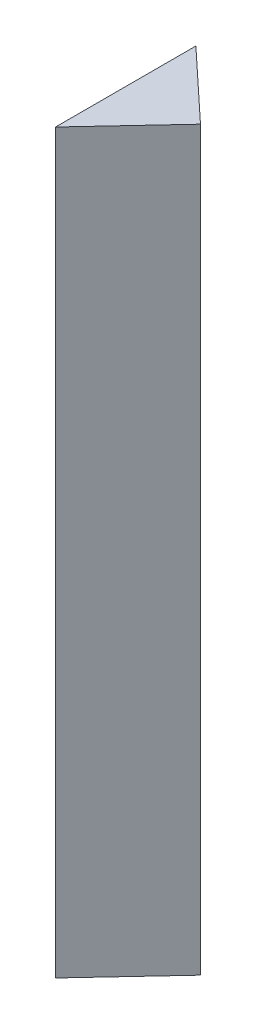
ISO-10303-21;
HEADER;
FILE_DESCRIPTION(('STEP AP214'),'2;1');
FILE_NAME('part.step','',(''),(''),'','','');
FILE_SCHEMA(('AUTOMOTIVE_DESIGN { 1 0 10303 214 1 1 1 1 }'));
ENDSEC;
DATA;
#1=APPLICATION_CONTEXT('core data for automotive mechanical design processes');
#2=APPLICATION_PROTOCOL_DEFINITION('international standard','automotive_design',2000,#1);
#3=PRODUCT_CONTEXT('',#1,'mechanical');
#4=PRODUCT('Part','Part','',(#3));
#5=PRODUCT_RELATED_PRODUCT_CATEGORY('part','',(#4));
#6=PRODUCT_DEFINITION_FORMATION('','',#4);
#7=PRODUCT_DEFINITION_CONTEXT('part definition',#1,'design');
#8=PRODUCT_DEFINITION('design','',#6,#7);
#9=PRODUCT_DEFINITION_SHAPE('','',#8);
#10=(LENGTH_UNIT() NAMED_UNIT(*) SI_UNIT(.MILLI.,.METRE.));
#11=(NAMED_UNIT(*) PLANE_ANGLE_UNIT() SI_UNIT($,.RADIAN.));
#12=(NAMED_UNIT(*) SI_UNIT($,.STERADIAN.) SOLID_ANGLE_UNIT());
#13=UNCERTAINTY_MEASURE_WITH_UNIT(LENGTH_MEASURE(1.E-05),#10,'distance_accuracy_value','');
#14=(GEOMETRIC_REPRESENTATION_CONTEXT(3) GLOBAL_UNCERTAINTY_ASSIGNED_CONTEXT((#13)) GLOBAL_UNIT_ASSIGNED_CONTEXT((#10,
#11,#12)) REPRESENTATION_CONTEXT('',''));
#15=CARTESIAN_POINT('',(0.,0.,0.));
#16=DIRECTION('',(0.,0.,1.));
#17=DIRECTION('',(1.,0.,0.));
#18=AXIS2_PLACEMENT_3D('',#15,#16,#17);
#19=CARTESIAN_POINT('',(-44.479485360507,-90.0039355965345,1.51634609183273));
#20=DIRECTION('',(0.730788160116969,0.,0.682604325383934));
#21=DIRECTION('',(0.682604325383934,0.,-0.730788160116969));
#22=AXIS2_PLACEMENT_3D('',#19,#20,#21);
#23=PLANE('',#22);
#24=DIRECTION('',(0.682604325383934,0.,-0.730788160116969));
#25=VECTOR('',#24,1.);
#26=CARTESIAN_POINT('',(-44.479485360507,-118.388824917021,1.51634609183283));
#27=LINE('',#26,#25);
#28=CARTESIAN_POINT('',(-57.1500000063566,-118.388824917021,15.0812500068026));
#29=VERTEX_POINT('',#28);
#30=CARTESIAN_POINT('',(-44.479485360507,-118.388824917021,1.51634609183287));
#31=VERTEX_POINT('',#30);
#32=EDGE_CURVE('E46',#29,#31,#27,.T.);
#33=ORIENTED_EDGE('',*,*,#32,.F.);
#34=DIRECTION('',(0.,-1.,0.));
#35=VECTOR('',#34,1.);
#36=CARTESIAN_POINT('',(-57.1500000063566,-90.0039355965344,15.0812500068021));
#37=LINE('',#36,#35);
#38=CARTESIAN_POINT('',(-57.1500000063568,-251.789847126195,15.0812500068026));
#39=VERTEX_POINT('',#38);
#40=EDGE_CURVE('E68',#29,#39,#37,.T.);
#41=ORIENTED_EDGE('',*,*,#40,.T.);
#42=DIRECTION('',(-0.682604325383934,0.,0.730788160116969));
#43=VECTOR('',#42,1.);
#44=CARTESIAN_POINT('',(-44.4794853605073,-251.789847126195,1.51634609183328));
#45=LINE('',#44,#43);
#46=CARTESIAN_POINT('',(-44.4794853605073,-251.789847126195,1.51634609183328));
#47=VERTEX_POINT('',#46);
#48=EDGE_CURVE('E72',#47,#39,#45,.T.);
#49=ORIENTED_EDGE('',*,*,#48,.F.);
#50=DIRECTION('',(0.,-1.,0.));
#51=VECTOR('',#50,1.);
#52=CARTESIAN_POINT('',(-44.479485360507,-90.0039355965345,1.51634609183273));
#53=LINE('',#52,#51);
#54=EDGE_CURVE('E90',#31,#47,#53,.T.);
#55=ORIENTED_EDGE('',*,*,#54,.F.);
#56=EDGE_LOOP('',(#33,#41,#49,#55));
#57=FACE_BOUND('',#56,.T.);
#58=ADVANCED_FACE('F39',(#57),#23,.T.);
#59=CARTESIAN_POINT('',(-57.1499999999998,-90.0039355965345,-10.3187500000004));
#60=DIRECTION('',(0.682604325383934,0.,-0.730788160116969));
#61=DIRECTION('',(-0.730788160116969,0.,-0.682604325383934));
#62=AXIS2_PLACEMENT_3D('',#59,#60,#61);
#63=PLANE('',#62);
#64=DIRECTION('',(-0.730788160116969,0.,-0.682604325383934));
#65=VECTOR('',#64,1.);
#66=CARTESIAN_POINT('',(-57.1499999999998,-118.388824917021,-10.3187500000003));
#67=LINE('',#66,#65);
#68=CARTESIAN_POINT('',(-57.1499999999998,-118.388824917021,-10.3187500000003));
#69=VERTEX_POINT('',#68);
#70=EDGE_CURVE('E92',#31,#69,#67,.T.);
#71=ORIENTED_EDGE('',*,*,#70,.F.);
#72=ORIENTED_EDGE('',*,*,#54,.T.);
#73=DIRECTION('',(0.730788160116969,0.,0.682604325383934));
#74=VECTOR('',#73,1.);
#75=CARTESIAN_POINT('',(-57.1500000000001,-251.789847126195,-10.3187499999998));
#76=LINE('',#75,#74);
#77=CARTESIAN_POINT('',(-57.1500000000001,-251.789847126195,-10.3187499999998));
#78=VERTEX_POINT('',#77);
#79=EDGE_CURVE('E76',#78,#47,#76,.T.);
#80=ORIENTED_EDGE('',*,*,#79,.F.);
#81=DIRECTION('',(0.,-1.,0.));
#82=VECTOR('',#81,1.);
#83=CARTESIAN_POINT('',(-57.1499999999998,-90.0039355965345,-10.3187500000004));
#84=LINE('',#83,#82);
#85=EDGE_CURVE('E75',#69,#78,#84,.T.);
#86=ORIENTED_EDGE('',*,*,#85,.F.);
#87=EDGE_LOOP('',(#71,#72,#80,#86));
#88=FACE_BOUND('',#87,.T.);
#89=ADVANCED_FACE('F95',(#88),#63,.T.);
#90=CARTESIAN_POINT('',(-57.1500000063566,-90.0039355965344,15.0812500068021));
#91=DIRECTION('',(-1.,0.,-2.50266506926154E-10));
#92=DIRECTION('',(-2.50266506926154E-10,0.,1.));
#93=AXIS2_PLACEMENT_3D('',#90,#91,#92);
#94=PLANE('',#93);
#95=DIRECTION('',(-2.50266506926154E-10,0.,1.));
#96=VECTOR('',#95,1.);
#97=CARTESIAN_POINT('',(-57.1500000063566,-118.388824917021,15.0812500068022));
#98=LINE('',#97,#96);
#99=EDGE_CURVE('E11',#69,#29,#98,.T.);
#100=ORIENTED_EDGE('',*,*,#99,.F.);
#101=ORIENTED_EDGE('',*,*,#85,.T.);
#102=DIRECTION('',(2.50266506926154E-10,0.,-1.));
#103=VECTOR('',#102,1.);
#104=CARTESIAN_POINT('',(-57.1500000063568,-251.789847126195,15.0812500068026));
#105=LINE('',#104,#103);
#106=EDGE_CURVE('E78',#39,#78,#105,.T.);
#107=ORIENTED_EDGE('',*,*,#106,.F.);
#108=ORIENTED_EDGE('',*,*,#40,.F.);
#109=EDGE_LOOP('',(#100,#101,#107,#108));
#110=FACE_BOUND('',#109,.T.);
#111=ADVANCED_FACE('F79',(#110),#94,.T.);
#112=CARTESIAN_POINT('',(-1.0279979781959E-12,-251.789847126195,1.10056254136275E-12));
#113=DIRECTION('',(0.,1.,0.));
#114=DIRECTION('',(0.,0.,1.));
#115=AXIS2_PLACEMENT_3D('',#112,#113,#114);
#116=PLANE('',#115);
#117=ORIENTED_EDGE('',*,*,#48,.T.);
#118=ORIENTED_EDGE('',*,*,#106,.T.);
#119=ORIENTED_EDGE('',*,*,#79,.T.);
#120=EDGE_LOOP('',(#117,#118,#119));
#121=FACE_BOUND('',#120,.T.);
#122=ADVANCED_FACE('F84',(#121),#116,.F.);
#123=CARTESIAN_POINT('',(-55.98073895017,-118.388824917021,16.1734169274167));
#124=DIRECTION('',(0.,-1.,0.));
#125=DIRECTION('',(-0.730788160116969,0.,-0.682604325383934));
#126=AXIS2_PLACEMENT_3D('',#123,#124,#125);
#127=PLANE('',#126);
#128=ORIENTED_EDGE('',*,*,#32,.T.);
#129=ORIENTED_EDGE('',*,*,#70,.T.);
#130=ORIENTED_EDGE('',*,*,#99,.T.);
#131=EDGE_LOOP('',(#128,#129,#130));
#132=FACE_BOUND('',#131,.T.);
#133=ADVANCED_FACE('F94',(#132),#127,.F.);
#134=CLOSED_SHELL('',(#58,#89,#111,#122,#133));
#135=MANIFOLD_SOLID_BREP('B2',#134);
#136=ADVANCED_BREP_SHAPE_REPRESENTATION('',(#18,#135),#14);
#137=SHAPE_DEFINITION_REPRESENTATION(#9,#136);
ENDSEC;
END-ISO-10303-21;
